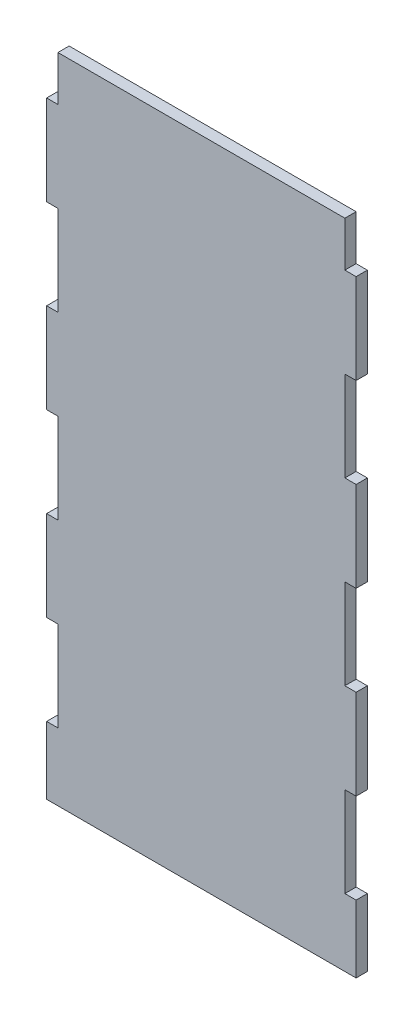
ISO-10303-21;
HEADER;
FILE_DESCRIPTION(('STEP AP214'),'2;1');
FILE_NAME('part.step','',(''),(''),'','','');
FILE_SCHEMA(('AUTOMOTIVE_DESIGN { 1 0 10303 214 1 1 1 1 }'));
ENDSEC;
DATA;
#1=APPLICATION_CONTEXT('core data for automotive mechanical design processes');
#2=APPLICATION_PROTOCOL_DEFINITION('international standard','automotive_design',2000,#1);
#3=PRODUCT_CONTEXT('',#1,'mechanical');
#4=PRODUCT('Part','Part','',(#3));
#5=PRODUCT_RELATED_PRODUCT_CATEGORY('part','',(#4));
#6=PRODUCT_DEFINITION_FORMATION('','',#4);
#7=PRODUCT_DEFINITION_CONTEXT('part definition',#1,'design');
#8=PRODUCT_DEFINITION('design','',#6,#7);
#9=PRODUCT_DEFINITION_SHAPE('','',#8);
#10=(LENGTH_UNIT() NAMED_UNIT(*) SI_UNIT(.MILLI.,.METRE.));
#11=(NAMED_UNIT(*) PLANE_ANGLE_UNIT() SI_UNIT($,.RADIAN.));
#12=(NAMED_UNIT(*) SI_UNIT($,.STERADIAN.) SOLID_ANGLE_UNIT());
#13=UNCERTAINTY_MEASURE_WITH_UNIT(LENGTH_MEASURE(1.E-05),#10,'distance_accuracy_value','');
#14=(GEOMETRIC_REPRESENTATION_CONTEXT(3) GLOBAL_UNCERTAINTY_ASSIGNED_CONTEXT((#13)) GLOBAL_UNIT_ASSIGNED_CONTEXT((#10,
#11,#12)) REPRESENTATION_CONTEXT('',''));
#15=CARTESIAN_POINT('',(0.,0.,0.));
#16=DIRECTION('',(0.,0.,1.));
#17=DIRECTION('',(1.,0.,0.));
#18=AXIS2_PLACEMENT_3D('',#15,#16,#17);
#19=CARTESIAN_POINT('',(0.,0.,3.175));
#20=DIRECTION('',(1.,0.,0.));
#21=DIRECTION('',(0.,1.,0.));
#22=AXIS2_PLACEMENT_3D('',#19,#20,#21);
#23=PLANE('',#22);
#24=DIRECTION('',(0.,-1.,0.));
#25=VECTOR('',#24,1.);
#26=CARTESIAN_POINT('',(0.,0.,0.));
#27=LINE('',#26,#25);
#28=CARTESIAN_POINT('',(0.,12.7,0.));
#29=VERTEX_POINT('',#28);
#30=CARTESIAN_POINT('',(0.,-12.7,0.));
#31=VERTEX_POINT('',#30);
#32=EDGE_CURVE('E157',#29,#31,#27,.T.);
#33=ORIENTED_EDGE('',*,*,#32,.T.);
#34=DIRECTION('',(0.,0.,-1.));
#35=VECTOR('',#34,1.);
#36=CARTESIAN_POINT('',(0.,-12.7,3.175));
#37=LINE('',#36,#35);
#38=CARTESIAN_POINT('',(0.,-12.7,3.175));
#39=VERTEX_POINT('',#38);
#40=EDGE_CURVE('E11',#39,#31,#37,.T.);
#41=ORIENTED_EDGE('',*,*,#40,.F.);
#42=DIRECTION('',(0.,-1.,0.));
#43=VECTOR('',#42,1.);
#44=CARTESIAN_POINT('',(0.,0.,3.175));
#45=LINE('',#44,#43);
#46=CARTESIAN_POINT('',(0.,12.7,3.175));
#47=VERTEX_POINT('',#46);
#48=EDGE_CURVE('E163',#47,#39,#45,.T.);
#49=ORIENTED_EDGE('',*,*,#48,.F.);
#50=DIRECTION('',(0.,0.,-1.));
#51=VECTOR('',#50,1.);
#52=CARTESIAN_POINT('',(0.,12.7,3.175));
#53=LINE('',#52,#51);
#54=EDGE_CURVE('E269',#47,#29,#53,.T.);
#55=ORIENTED_EDGE('',*,*,#54,.T.);
#56=EDGE_LOOP('',(#33,#41,#49,#55));
#57=FACE_BOUND('',#56,.T.);
#58=ADVANCED_FACE('F33',(#57),#23,.F.);
#59=CARTESIAN_POINT('',(0.,-12.7,3.175));
#60=DIRECTION('',(0.,-1.,0.));
#61=DIRECTION('',(0.,0.,-1.));
#62=AXIS2_PLACEMENT_3D('',#59,#60,#61);
#63=PLANE('',#62);
#64=DIRECTION('',(-1.,0.,0.));
#65=VECTOR('',#64,1.);
#66=CARTESIAN_POINT('',(0.,-12.7,0.));
#67=LINE('',#66,#65);
#68=CARTESIAN_POINT('',(-3.17499999999998,-12.7,0.));
#69=VERTEX_POINT('',#68);
#70=EDGE_CURVE('E274',#31,#69,#67,.T.);
#71=ORIENTED_EDGE('',*,*,#70,.T.);
#72=DIRECTION('',(0.,0.,-1.));
#73=VECTOR('',#72,1.);
#74=CARTESIAN_POINT('',(-3.17499999999998,-12.7,3.175));
#75=LINE('',#74,#73);
#76=CARTESIAN_POINT('',(-3.17499999999998,-12.7,3.175));
#77=VERTEX_POINT('',#76);
#78=EDGE_CURVE('E41',#77,#69,#75,.T.);
#79=ORIENTED_EDGE('',*,*,#78,.F.);
#80=DIRECTION('',(-1.,0.,0.));
#81=VECTOR('',#80,1.);
#82=CARTESIAN_POINT('',(0.,-12.7,3.175));
#83=LINE('',#82,#81);
#84=EDGE_CURVE('E503',#39,#77,#83,.T.);
#85=ORIENTED_EDGE('',*,*,#84,.F.);
#86=ORIENTED_EDGE('',*,*,#40,.T.);
#87=EDGE_LOOP('',(#71,#79,#85,#86));
#88=FACE_BOUND('',#87,.T.);
#89=ADVANCED_FACE('F506',(#88),#63,.F.);
#90=CARTESIAN_POINT('',(-3.17499999999998,-12.7,3.175));
#91=DIRECTION('',(1.,0.,0.));
#92=DIRECTION('',(0.,1.,0.));
#93=AXIS2_PLACEMENT_3D('',#90,#91,#92);
#94=PLANE('',#93);
#95=DIRECTION('',(0.,-1.,0.));
#96=VECTOR('',#95,1.);
#97=CARTESIAN_POINT('',(-3.17499999999998,-12.7,0.));
#98=LINE('',#97,#96);
#99=CARTESIAN_POINT('',(-3.175,-31.75,0.));
#100=VERTEX_POINT('',#99);
#101=EDGE_CURVE('E276',#69,#100,#98,.T.);
#102=ORIENTED_EDGE('',*,*,#101,.T.);
#103=DIRECTION('',(0.,0.,-1.));
#104=VECTOR('',#103,1.);
#105=CARTESIAN_POINT('',(-3.175,-31.75,3.175));
#106=LINE('',#105,#104);
#107=CARTESIAN_POINT('',(-3.175,-31.75,3.175));
#108=VERTEX_POINT('',#107);
#109=EDGE_CURVE('E414',#108,#100,#106,.T.);
#110=ORIENTED_EDGE('',*,*,#109,.F.);
#111=DIRECTION('',(0.,-1.,0.));
#112=VECTOR('',#111,1.);
#113=CARTESIAN_POINT('',(-3.17499999999998,-12.7,3.175));
#114=LINE('',#113,#112);
#115=EDGE_CURVE('E423',#77,#108,#114,.T.);
#116=ORIENTED_EDGE('',*,*,#115,.F.);
#117=ORIENTED_EDGE('',*,*,#78,.T.);
#118=EDGE_LOOP('',(#102,#110,#116,#117));
#119=FACE_BOUND('',#118,.T.);
#120=ADVANCED_FACE('F421',(#119),#94,.F.);
#121=CARTESIAN_POINT('',(-3.175,-31.75,3.175));
#122=DIRECTION('',(0.,1.,0.));
#123=DIRECTION('',(-1.,0.,0.));
#124=AXIS2_PLACEMENT_3D('',#121,#122,#123);
#125=PLANE('',#124);
#126=DIRECTION('',(1.,0.,0.));
#127=VECTOR('',#126,1.);
#128=CARTESIAN_POINT('',(-3.175,-31.75,0.));
#129=LINE('',#128,#127);
#130=CARTESIAN_POINT('',(84.175,-31.75,0.));
#131=VERTEX_POINT('',#130);
#132=EDGE_CURVE('E278',#100,#131,#129,.T.);
#133=ORIENTED_EDGE('',*,*,#132,.T.);
#134=DIRECTION('',(0.,0.,-1.));
#135=VECTOR('',#134,1.);
#136=CARTESIAN_POINT('',(84.175,-31.75,3.175));
#137=LINE('',#136,#135);
#138=CARTESIAN_POINT('',(84.175,-31.75,3.175));
#139=VERTEX_POINT('',#138);
#140=EDGE_CURVE('E411',#139,#131,#137,.T.);
#141=ORIENTED_EDGE('',*,*,#140,.F.);
#142=DIRECTION('',(1.,0.,0.));
#143=VECTOR('',#142,1.);
#144=CARTESIAN_POINT('',(-3.175,-31.75,3.175));
#145=LINE('',#144,#143);
#146=EDGE_CURVE('E441',#108,#139,#145,.T.);
#147=ORIENTED_EDGE('',*,*,#146,.F.);
#148=ORIENTED_EDGE('',*,*,#109,.T.);
#149=EDGE_LOOP('',(#133,#141,#147,#148));
#150=FACE_BOUND('',#149,.T.);
#151=ADVANCED_FACE('F432',(#150),#125,.F.);
#152=CARTESIAN_POINT('',(84.175,-12.6999999999999,3.175));
#153=DIRECTION('',(-1.,0.,0.));
#154=DIRECTION('',(0.,-1.,0.));
#155=AXIS2_PLACEMENT_3D('',#152,#153,#154);
#156=PLANE('',#155);
#157=DIRECTION('',(0.,1.,0.));
#158=VECTOR('',#157,1.);
#159=CARTESIAN_POINT('',(84.175,-12.6999999999999,0.));
#160=LINE('',#159,#158);
#161=CARTESIAN_POINT('',(84.175,-12.6999999999999,0.));
#162=VERTEX_POINT('',#161);
#163=EDGE_CURVE('E280',#131,#162,#160,.T.);
#164=ORIENTED_EDGE('',*,*,#163,.T.);
#165=DIRECTION('',(0.,0.,-1.));
#166=VECTOR('',#165,1.);
#167=CARTESIAN_POINT('',(84.175,-12.6999999999999,3.175));
#168=LINE('',#167,#166);
#169=CARTESIAN_POINT('',(84.175,-12.6999999999999,3.175));
#170=VERTEX_POINT('',#169);
#171=EDGE_CURVE('E408',#170,#162,#168,.T.);
#172=ORIENTED_EDGE('',*,*,#171,.F.);
#173=DIRECTION('',(0.,1.,0.));
#174=VECTOR('',#173,1.);
#175=CARTESIAN_POINT('',(84.175,-12.6999999999999,3.175));
#176=LINE('',#175,#174);
#177=EDGE_CURVE('E438',#139,#170,#176,.T.);
#178=ORIENTED_EDGE('',*,*,#177,.F.);
#179=ORIENTED_EDGE('',*,*,#140,.T.);
#180=EDGE_LOOP('',(#164,#172,#178,#179));
#181=FACE_BOUND('',#180,.T.);
#182=ADVANCED_FACE('F436',(#181),#156,.F.);
#183=CARTESIAN_POINT('',(81.,-12.6999999999999,3.175));
#184=DIRECTION('',(0.,-1.,0.));
#185=DIRECTION('',(0.,0.,-1.));
#186=AXIS2_PLACEMENT_3D('',#183,#184,#185);
#187=PLANE('',#186);
#188=DIRECTION('',(-1.,0.,0.));
#189=VECTOR('',#188,1.);
#190=CARTESIAN_POINT('',(81.,-12.6999999999999,0.));
#191=LINE('',#190,#189);
#192=CARTESIAN_POINT('',(81.,-12.6999999999999,0.));
#193=VERTEX_POINT('',#192);
#194=EDGE_CURVE('E282',#162,#193,#191,.T.);
#195=ORIENTED_EDGE('',*,*,#194,.T.);
#196=DIRECTION('',(0.,0.,-1.));
#197=VECTOR('',#196,1.);
#198=CARTESIAN_POINT('',(81.,-12.6999999999999,3.175));
#199=LINE('',#198,#197);
#200=CARTESIAN_POINT('',(81.,-12.6999999999999,3.175));
#201=VERTEX_POINT('',#200);
#202=EDGE_CURVE('E405',#201,#193,#199,.T.);
#203=ORIENTED_EDGE('',*,*,#202,.F.);
#204=DIRECTION('',(-1.,0.,0.));
#205=VECTOR('',#204,1.);
#206=CARTESIAN_POINT('',(81.,-12.6999999999999,3.175));
#207=LINE('',#206,#205);
#208=EDGE_CURVE('E440',#170,#201,#207,.T.);
#209=ORIENTED_EDGE('',*,*,#208,.F.);
#210=ORIENTED_EDGE('',*,*,#171,.T.);
#211=EDGE_LOOP('',(#195,#203,#209,#210));
#212=FACE_BOUND('',#211,.T.);
#213=ADVANCED_FACE('F518',(#212),#187,.F.);
#214=CARTESIAN_POINT('',(81.,1.11022302462516E-13,3.175));
#215=DIRECTION('',(-1.,0.,0.));
#216=DIRECTION('',(0.,0.,1.));
#217=AXIS2_PLACEMENT_3D('',#214,#215,#216);
#218=PLANE('',#217);
#219=DIRECTION('',(0.,1.,0.));
#220=VECTOR('',#219,1.);
#221=CARTESIAN_POINT('',(81.,1.11022302462516E-13,0.));
#222=LINE('',#221,#220);
#223=CARTESIAN_POINT('',(81.,12.7000000000001,0.));
#224=VERTEX_POINT('',#223);
#225=EDGE_CURVE('E285',#193,#224,#222,.T.);
#226=ORIENTED_EDGE('',*,*,#225,.T.);
#227=DIRECTION('',(0.,0.,-1.));
#228=VECTOR('',#227,1.);
#229=CARTESIAN_POINT('',(81.,12.7000000000001,3.175));
#230=LINE('',#229,#228);
#231=CARTESIAN_POINT('',(81.,12.7000000000001,3.175));
#232=VERTEX_POINT('',#231);
#233=EDGE_CURVE('E402',#232,#224,#230,.T.);
#234=ORIENTED_EDGE('',*,*,#233,.F.);
#235=DIRECTION('',(0.,1.,0.));
#236=VECTOR('',#235,1.);
#237=CARTESIAN_POINT('',(81.,1.11022302462516E-13,3.175));
#238=LINE('',#237,#236);
#239=EDGE_CURVE('E443',#201,#232,#238,.T.);
#240=ORIENTED_EDGE('',*,*,#239,.F.);
#241=ORIENTED_EDGE('',*,*,#202,.T.);
#242=EDGE_LOOP('',(#226,#234,#240,#241));
#243=FACE_BOUND('',#242,.T.);
#244=ADVANCED_FACE('F521',(#243),#218,.F.);
#245=CARTESIAN_POINT('',(84.175,12.7000000000001,3.175));
#246=DIRECTION('',(0.,1.,0.));
#247=DIRECTION('',(-1.,0.,0.));
#248=AXIS2_PLACEMENT_3D('',#245,#246,#247);
#249=PLANE('',#248);
#250=DIRECTION('',(1.,0.,0.));
#251=VECTOR('',#250,1.);
#252=CARTESIAN_POINT('',(84.175,12.7000000000001,0.));
#253=LINE('',#252,#251);
#254=CARTESIAN_POINT('',(84.175,12.7000000000001,0.));
#255=VERTEX_POINT('',#254);
#256=EDGE_CURVE('E287',#224,#255,#253,.T.);
#257=ORIENTED_EDGE('',*,*,#256,.T.);
#258=DIRECTION('',(0.,0.,-1.));
#259=VECTOR('',#258,1.);
#260=CARTESIAN_POINT('',(84.175,12.7000000000001,3.175));
#261=LINE('',#260,#259);
#262=CARTESIAN_POINT('',(84.175,12.7000000000001,3.175));
#263=VERTEX_POINT('',#262);
#264=EDGE_CURVE('E399',#263,#255,#261,.T.);
#265=ORIENTED_EDGE('',*,*,#264,.F.);
#266=DIRECTION('',(1.,0.,0.));
#267=VECTOR('',#266,1.);
#268=CARTESIAN_POINT('',(84.175,12.7000000000001,3.175));
#269=LINE('',#268,#267);
#270=EDGE_CURVE('E449',#232,#263,#269,.T.);
#271=ORIENTED_EDGE('',*,*,#270,.F.);
#272=ORIENTED_EDGE('',*,*,#233,.T.);
#273=EDGE_LOOP('',(#257,#265,#271,#272));
#274=FACE_BOUND('',#273,.T.);
#275=ADVANCED_FACE('F525',(#274),#249,.F.);
#276=CARTESIAN_POINT('',(84.175,38.1000000000001,3.175));
#277=DIRECTION('',(-1.,0.,0.));
#278=DIRECTION('',(0.,-1.,0.));
#279=AXIS2_PLACEMENT_3D('',#276,#277,#278);
#280=PLANE('',#279);
#281=DIRECTION('',(0.,1.,0.));
#282=VECTOR('',#281,1.);
#283=CARTESIAN_POINT('',(84.175,38.1000000000001,0.));
#284=LINE('',#283,#282);
#285=CARTESIAN_POINT('',(84.175,38.1000000000001,0.));
#286=VERTEX_POINT('',#285);
#287=EDGE_CURVE('E289',#255,#286,#284,.T.);
#288=ORIENTED_EDGE('',*,*,#287,.T.);
#289=DIRECTION('',(0.,0.,-1.));
#290=VECTOR('',#289,1.);
#291=CARTESIAN_POINT('',(84.175,38.1000000000001,3.175));
#292=LINE('',#291,#290);
#293=CARTESIAN_POINT('',(84.175,38.1000000000001,3.175));
#294=VERTEX_POINT('',#293);
#295=EDGE_CURVE('E396',#294,#286,#292,.T.);
#296=ORIENTED_EDGE('',*,*,#295,.F.);
#297=DIRECTION('',(0.,1.,0.));
#298=VECTOR('',#297,1.);
#299=CARTESIAN_POINT('',(84.175,38.1000000000001,3.175));
#300=LINE('',#299,#298);
#301=EDGE_CURVE('E451',#263,#294,#300,.T.);
#302=ORIENTED_EDGE('',*,*,#301,.F.);
#303=ORIENTED_EDGE('',*,*,#264,.T.);
#304=EDGE_LOOP('',(#288,#296,#302,#303));
#305=FACE_BOUND('',#304,.T.);
#306=ADVANCED_FACE('F529',(#305),#280,.F.);
#307=CARTESIAN_POINT('',(81.,38.1000000000001,3.175));
#308=DIRECTION('',(0.,-1.,0.));
#309=DIRECTION('',(0.,0.,-1.));
#310=AXIS2_PLACEMENT_3D('',#307,#308,#309);
#311=PLANE('',#310);
#312=DIRECTION('',(-1.,0.,0.));
#313=VECTOR('',#312,1.);
#314=CARTESIAN_POINT('',(81.,38.1000000000001,0.));
#315=LINE('',#314,#313);
#316=CARTESIAN_POINT('',(81.,38.1000000000001,0.));
#317=VERTEX_POINT('',#316);
#318=EDGE_CURVE('E291',#286,#317,#315,.T.);
#319=ORIENTED_EDGE('',*,*,#318,.T.);
#320=DIRECTION('',(0.,0.,-1.));
#321=VECTOR('',#320,1.);
#322=CARTESIAN_POINT('',(81.,38.1000000000001,3.175));
#323=LINE('',#322,#321);
#324=CARTESIAN_POINT('',(81.,38.1000000000001,3.175));
#325=VERTEX_POINT('',#324);
#326=EDGE_CURVE('E393',#325,#317,#323,.T.);
#327=ORIENTED_EDGE('',*,*,#326,.F.);
#328=DIRECTION('',(-1.,0.,0.));
#329=VECTOR('',#328,1.);
#330=CARTESIAN_POINT('',(81.,38.1000000000001,3.175));
#331=LINE('',#330,#329);
#332=EDGE_CURVE('E453',#294,#325,#331,.T.);
#333=ORIENTED_EDGE('',*,*,#332,.F.);
#334=ORIENTED_EDGE('',*,*,#295,.T.);
#335=EDGE_LOOP('',(#319,#327,#333,#334));
#336=FACE_BOUND('',#335,.T.);
#337=ADVANCED_FACE('F533',(#336),#311,.F.);
#338=CARTESIAN_POINT('',(81.,38.1000000000001,3.175));
#339=DIRECTION('',(-1.,0.,0.));
#340=DIRECTION('',(0.,-1.,0.));
#341=AXIS2_PLACEMENT_3D('',#338,#339,#340);
#342=PLANE('',#341);
#343=DIRECTION('',(0.,1.,0.));
#344=VECTOR('',#343,1.);
#345=CARTESIAN_POINT('',(81.,38.1000000000001,0.));
#346=LINE('',#345,#344);
#347=CARTESIAN_POINT('',(81.,63.5000000000001,0.));
#348=VERTEX_POINT('',#347);
#349=EDGE_CURVE('E293',#317,#348,#346,.T.);
#350=ORIENTED_EDGE('',*,*,#349,.T.);
#351=DIRECTION('',(0.,0.,-1.));
#352=VECTOR('',#351,1.);
#353=CARTESIAN_POINT('',(81.,63.5000000000001,3.175));
#354=LINE('',#353,#352);
#355=CARTESIAN_POINT('',(81.,63.5000000000001,3.175));
#356=VERTEX_POINT('',#355);
#357=EDGE_CURVE('E390',#356,#348,#354,.T.);
#358=ORIENTED_EDGE('',*,*,#357,.F.);
#359=DIRECTION('',(0.,1.,0.));
#360=VECTOR('',#359,1.);
#361=CARTESIAN_POINT('',(81.,38.1000000000001,3.175));
#362=LINE('',#361,#360);
#363=EDGE_CURVE('E455',#325,#356,#362,.T.);
#364=ORIENTED_EDGE('',*,*,#363,.F.);
#365=ORIENTED_EDGE('',*,*,#326,.T.);
#366=EDGE_LOOP('',(#350,#358,#364,#365));
#367=FACE_BOUND('',#366,.T.);
#368=ADVANCED_FACE('F537',(#367),#342,.F.);
#369=CARTESIAN_POINT('',(84.175,63.5000000000001,3.175));
#370=DIRECTION('',(0.,1.,0.));
#371=DIRECTION('',(0.,0.,1.));
#372=AXIS2_PLACEMENT_3D('',#369,#370,#371);
#373=PLANE('',#372);
#374=DIRECTION('',(1.,0.,0.));
#375=VECTOR('',#374,1.);
#376=CARTESIAN_POINT('',(84.175,63.5000000000001,0.));
#377=LINE('',#376,#375);
#378=CARTESIAN_POINT('',(84.175,63.5000000000001,0.));
#379=VERTEX_POINT('',#378);
#380=EDGE_CURVE('E295',#348,#379,#377,.T.);
#381=ORIENTED_EDGE('',*,*,#380,.T.);
#382=DIRECTION('',(0.,0.,-1.));
#383=VECTOR('',#382,1.);
#384=CARTESIAN_POINT('',(84.175,63.5000000000001,3.175));
#385=LINE('',#384,#383);
#386=CARTESIAN_POINT('',(84.175,63.5000000000001,3.175));
#387=VERTEX_POINT('',#386);
#388=EDGE_CURVE('E387',#387,#379,#385,.T.);
#389=ORIENTED_EDGE('',*,*,#388,.F.);
#390=DIRECTION('',(1.,0.,0.));
#391=VECTOR('',#390,1.);
#392=CARTESIAN_POINT('',(84.175,63.5000000000001,3.175));
#393=LINE('',#392,#391);
#394=EDGE_CURVE('E457',#356,#387,#393,.T.);
#395=ORIENTED_EDGE('',*,*,#394,.F.);
#396=ORIENTED_EDGE('',*,*,#357,.T.);
#397=EDGE_LOOP('',(#381,#389,#395,#396));
#398=FACE_BOUND('',#397,.T.);
#399=ADVANCED_FACE('F541',(#398),#373,.F.);
#400=CARTESIAN_POINT('',(84.175,88.9000000000001,3.175));
#401=DIRECTION('',(-1.,0.,0.));
#402=DIRECTION('',(0.,0.,1.));
#403=AXIS2_PLACEMENT_3D('',#400,#401,#402);
#404=PLANE('',#403);
#405=DIRECTION('',(0.,1.,0.));
#406=VECTOR('',#405,1.);
#407=CARTESIAN_POINT('',(84.175,88.9000000000001,0.));
#408=LINE('',#407,#406);
#409=CARTESIAN_POINT('',(84.175,88.9000000000001,0.));
#410=VERTEX_POINT('',#409);
#411=EDGE_CURVE('E297',#379,#410,#408,.T.);
#412=ORIENTED_EDGE('',*,*,#411,.T.);
#413=DIRECTION('',(0.,0.,-1.));
#414=VECTOR('',#413,1.);
#415=CARTESIAN_POINT('',(84.175,88.9000000000001,3.175));
#416=LINE('',#415,#414);
#417=CARTESIAN_POINT('',(84.175,88.9000000000001,3.175));
#418=VERTEX_POINT('',#417);
#419=EDGE_CURVE('E384',#418,#410,#416,.T.);
#420=ORIENTED_EDGE('',*,*,#419,.F.);
#421=DIRECTION('',(0.,1.,0.));
#422=VECTOR('',#421,1.);
#423=CARTESIAN_POINT('',(84.175,88.9000000000001,3.175));
#424=LINE('',#423,#422);
#425=EDGE_CURVE('E459',#387,#418,#424,.T.);
#426=ORIENTED_EDGE('',*,*,#425,.F.);
#427=ORIENTED_EDGE('',*,*,#388,.T.);
#428=EDGE_LOOP('',(#412,#420,#426,#427));
#429=FACE_BOUND('',#428,.T.);
#430=ADVANCED_FACE('F545',(#429),#404,.F.);
#431=CARTESIAN_POINT('',(81.,88.9000000000001,3.175));
#432=DIRECTION('',(0.,-1.,0.));
#433=DIRECTION('',(0.,0.,-1.));
#434=AXIS2_PLACEMENT_3D('',#431,#432,#433);
#435=PLANE('',#434);
#436=DIRECTION('',(-1.,0.,0.));
#437=VECTOR('',#436,1.);
#438=CARTESIAN_POINT('',(81.,88.9000000000001,0.));
#439=LINE('',#438,#437);
#440=CARTESIAN_POINT('',(81.,88.9000000000001,0.));
#441=VERTEX_POINT('',#440);
#442=EDGE_CURVE('E299',#410,#441,#439,.T.);
#443=ORIENTED_EDGE('',*,*,#442,.T.);
#444=DIRECTION('',(0.,0.,-1.));
#445=VECTOR('',#444,1.);
#446=CARTESIAN_POINT('',(81.,88.9000000000001,3.175));
#447=LINE('',#446,#445);
#448=CARTESIAN_POINT('',(81.,88.9000000000001,3.175));
#449=VERTEX_POINT('',#448);
#450=EDGE_CURVE('E381',#449,#441,#447,.T.);
#451=ORIENTED_EDGE('',*,*,#450,.F.);
#452=DIRECTION('',(-1.,0.,0.));
#453=VECTOR('',#452,1.);
#454=CARTESIAN_POINT('',(81.,88.9000000000001,3.175));
#455=LINE('',#454,#453);
#456=EDGE_CURVE('E461',#418,#449,#455,.T.);
#457=ORIENTED_EDGE('',*,*,#456,.F.);
#458=ORIENTED_EDGE('',*,*,#419,.T.);
#459=EDGE_LOOP('',(#443,#451,#457,#458));
#460=FACE_BOUND('',#459,.T.);
#461=ADVANCED_FACE('F549',(#460),#435,.F.);
#462=CARTESIAN_POINT('',(81.,88.9000000000001,3.175));
#463=DIRECTION('',(-1.,0.,0.));
#464=DIRECTION('',(0.,-1.,0.));
#465=AXIS2_PLACEMENT_3D('',#462,#463,#464);
#466=PLANE('',#465);
#467=DIRECTION('',(0.,1.,0.));
#468=VECTOR('',#467,1.);
#469=CARTESIAN_POINT('',(81.,88.9000000000001,0.));
#470=LINE('',#469,#468);
#471=CARTESIAN_POINT('',(81.,114.3,0.));
#472=VERTEX_POINT('',#471);
#473=EDGE_CURVE('E301',#441,#472,#470,.T.);
#474=ORIENTED_EDGE('',*,*,#473,.T.);
#475=DIRECTION('',(0.,0.,-1.));
#476=VECTOR('',#475,1.);
#477=CARTESIAN_POINT('',(81.,114.3,3.175));
#478=LINE('',#477,#476);
#479=CARTESIAN_POINT('',(81.,114.3,3.175));
#480=VERTEX_POINT('',#479);
#481=EDGE_CURVE('E378',#480,#472,#478,.T.);
#482=ORIENTED_EDGE('',*,*,#481,.F.);
#483=DIRECTION('',(0.,1.,0.));
#484=VECTOR('',#483,1.);
#485=CARTESIAN_POINT('',(81.,88.9000000000001,3.175));
#486=LINE('',#485,#484);
#487=EDGE_CURVE('E463',#449,#480,#486,.T.);
#488=ORIENTED_EDGE('',*,*,#487,.F.);
#489=ORIENTED_EDGE('',*,*,#450,.T.);
#490=EDGE_LOOP('',(#474,#482,#488,#489));
#491=FACE_BOUND('',#490,.T.);
#492=ADVANCED_FACE('F553',(#491),#466,.F.);
#493=CARTESIAN_POINT('',(84.175,114.3,3.175));
#494=DIRECTION('',(0.,1.,0.));
#495=DIRECTION('',(0.,0.,1.));
#496=AXIS2_PLACEMENT_3D('',#493,#494,#495);
#497=PLANE('',#496);
#498=DIRECTION('',(1.,0.,0.));
#499=VECTOR('',#498,1.);
#500=CARTESIAN_POINT('',(84.175,114.3,0.));
#501=LINE('',#500,#499);
#502=CARTESIAN_POINT('',(84.175,114.3,0.));
#503=VERTEX_POINT('',#502);
#504=EDGE_CURVE('E303',#472,#503,#501,.T.);
#505=ORIENTED_EDGE('',*,*,#504,.T.);
#506=DIRECTION('',(0.,0.,-1.));
#507=VECTOR('',#506,1.);
#508=CARTESIAN_POINT('',(84.175,114.3,3.175));
#509=LINE('',#508,#507);
#510=CARTESIAN_POINT('',(84.175,114.3,3.175));
#511=VERTEX_POINT('',#510);
#512=EDGE_CURVE('E375',#511,#503,#509,.T.);
#513=ORIENTED_EDGE('',*,*,#512,.F.);
#514=DIRECTION('',(1.,0.,0.));
#515=VECTOR('',#514,1.);
#516=CARTESIAN_POINT('',(84.175,114.3,3.175));
#517=LINE('',#516,#515);
#518=EDGE_CURVE('E465',#480,#511,#517,.T.);
#519=ORIENTED_EDGE('',*,*,#518,.F.);
#520=ORIENTED_EDGE('',*,*,#481,.T.);
#521=EDGE_LOOP('',(#505,#513,#519,#520));
#522=FACE_BOUND('',#521,.T.);
#523=ADVANCED_FACE('F557',(#522),#497,.F.);
#524=CARTESIAN_POINT('',(84.175,139.7,3.175));
#525=DIRECTION('',(-1.,0.,0.));
#526=DIRECTION('',(0.,-1.,0.));
#527=AXIS2_PLACEMENT_3D('',#524,#525,#526);
#528=PLANE('',#527);
#529=DIRECTION('',(0.,1.,0.));
#530=VECTOR('',#529,1.);
#531=CARTESIAN_POINT('',(84.175,139.7,0.));
#532=LINE('',#531,#530);
#533=CARTESIAN_POINT('',(84.175,139.7,0.));
#534=VERTEX_POINT('',#533);
#535=EDGE_CURVE('E305',#503,#534,#532,.T.);
#536=ORIENTED_EDGE('',*,*,#535,.T.);
#537=DIRECTION('',(0.,0.,-1.));
#538=VECTOR('',#537,1.);
#539=CARTESIAN_POINT('',(84.175,139.7,3.175));
#540=LINE('',#539,#538);
#541=CARTESIAN_POINT('',(84.175,139.7,3.175));
#542=VERTEX_POINT('',#541);
#543=EDGE_CURVE('E372',#542,#534,#540,.T.);
#544=ORIENTED_EDGE('',*,*,#543,.F.);
#545=DIRECTION('',(0.,1.,0.));
#546=VECTOR('',#545,1.);
#547=CARTESIAN_POINT('',(84.175,139.7,3.175));
#548=LINE('',#547,#546);
#549=EDGE_CURVE('E467',#511,#542,#548,.T.);
#550=ORIENTED_EDGE('',*,*,#549,.F.);
#551=ORIENTED_EDGE('',*,*,#512,.T.);
#552=EDGE_LOOP('',(#536,#544,#550,#551));
#553=FACE_BOUND('',#552,.T.);
#554=ADVANCED_FACE('F561',(#553),#528,.F.);
#555=CARTESIAN_POINT('',(81.,139.7,3.175));
#556=DIRECTION('',(0.,-1.,0.));
#557=DIRECTION('',(1.,0.,0.));
#558=AXIS2_PLACEMENT_3D('',#555,#556,#557);
#559=PLANE('',#558);
#560=DIRECTION('',(-1.,0.,0.));
#561=VECTOR('',#560,1.);
#562=CARTESIAN_POINT('',(81.,139.7,0.));
#563=LINE('',#562,#561);
#564=CARTESIAN_POINT('',(81.,139.7,0.));
#565=VERTEX_POINT('',#564);
#566=EDGE_CURVE('E307',#534,#565,#563,.T.);
#567=ORIENTED_EDGE('',*,*,#566,.T.);
#568=DIRECTION('',(0.,0.,-1.));
#569=VECTOR('',#568,1.);
#570=CARTESIAN_POINT('',(81.,139.7,3.175));
#571=LINE('',#570,#569);
#572=CARTESIAN_POINT('',(81.,139.7,3.175));
#573=VERTEX_POINT('',#572);
#574=EDGE_CURVE('E369',#573,#565,#571,.T.);
#575=ORIENTED_EDGE('',*,*,#574,.F.);
#576=DIRECTION('',(-1.,0.,0.));
#577=VECTOR('',#576,1.);
#578=CARTESIAN_POINT('',(81.,139.7,3.175));
#579=LINE('',#578,#577);
#580=EDGE_CURVE('E469',#542,#573,#579,.T.);
#581=ORIENTED_EDGE('',*,*,#580,.F.);
#582=ORIENTED_EDGE('',*,*,#543,.T.);
#583=EDGE_LOOP('',(#567,#575,#581,#582));
#584=FACE_BOUND('',#583,.T.);
#585=ADVANCED_FACE('F565',(#584),#559,.F.);
#586=CARTESIAN_POINT('',(81.,139.7,3.175));
#587=DIRECTION('',(-1.,0.,0.));
#588=DIRECTION('',(0.,0.,1.));
#589=AXIS2_PLACEMENT_3D('',#586,#587,#588);
#590=PLANE('',#589);
#591=DIRECTION('',(0.,1.,0.));
#592=VECTOR('',#591,1.);
#593=CARTESIAN_POINT('',(81.,139.7,0.));
#594=LINE('',#593,#592);
#595=CARTESIAN_POINT('',(81.,152.4,0.));
#596=VERTEX_POINT('',#595);
#597=EDGE_CURVE('E309',#565,#596,#594,.T.);
#598=ORIENTED_EDGE('',*,*,#597,.T.);
#599=DIRECTION('',(0.,0.,-1.));
#600=VECTOR('',#599,1.);
#601=CARTESIAN_POINT('',(81.,152.4,3.175));
#602=LINE('',#601,#600);
#603=CARTESIAN_POINT('',(81.,152.4,3.175));
#604=VERTEX_POINT('',#603);
#605=EDGE_CURVE('E366',#604,#596,#602,.T.);
#606=ORIENTED_EDGE('',*,*,#605,.F.);
#607=DIRECTION('',(0.,1.,0.));
#608=VECTOR('',#607,1.);
#609=CARTESIAN_POINT('',(81.,139.7,3.175));
#610=LINE('',#609,#608);
#611=EDGE_CURVE('E471',#573,#604,#610,.T.);
#612=ORIENTED_EDGE('',*,*,#611,.F.);
#613=ORIENTED_EDGE('',*,*,#574,.T.);
#614=EDGE_LOOP('',(#598,#606,#612,#613));
#615=FACE_BOUND('',#614,.T.);
#616=ADVANCED_FACE('F569',(#615),#590,.F.);
#617=CARTESIAN_POINT('',(0.,152.4,3.175));
#618=DIRECTION('',(0.,-1.,0.));
#619=DIRECTION('',(0.,0.,-1.));
#620=AXIS2_PLACEMENT_3D('',#617,#618,#619);
#621=PLANE('',#620);
#622=DIRECTION('',(-1.,0.,0.));
#623=VECTOR('',#622,1.);
#624=CARTESIAN_POINT('',(0.,152.4,0.));
#625=LINE('',#624,#623);
#626=CARTESIAN_POINT('',(0.,152.4,0.));
#627=VERTEX_POINT('',#626);
#628=EDGE_CURVE('E311',#596,#627,#625,.T.);
#629=ORIENTED_EDGE('',*,*,#628,.T.);
#630=DIRECTION('',(0.,0.,-1.));
#631=VECTOR('',#630,1.);
#632=CARTESIAN_POINT('',(0.,152.4,3.175));
#633=LINE('',#632,#631);
#634=CARTESIAN_POINT('',(0.,152.4,3.175));
#635=VERTEX_POINT('',#634);
#636=EDGE_CURVE('E363',#635,#627,#633,.T.);
#637=ORIENTED_EDGE('',*,*,#636,.F.);
#638=DIRECTION('',(-1.,0.,0.));
#639=VECTOR('',#638,1.);
#640=CARTESIAN_POINT('',(0.,152.4,3.175));
#641=LINE('',#640,#639);
#642=EDGE_CURVE('E473',#604,#635,#641,.T.);
#643=ORIENTED_EDGE('',*,*,#642,.F.);
#644=ORIENTED_EDGE('',*,*,#605,.T.);
#645=EDGE_LOOP('',(#629,#637,#643,#644));
#646=FACE_BOUND('',#645,.T.);
#647=ADVANCED_FACE('F573',(#646),#621,.F.);
#648=CARTESIAN_POINT('',(0.,139.7,3.175));
#649=DIRECTION('',(1.,0.,0.));
#650=DIRECTION('',(0.,0.,-1.));
#651=AXIS2_PLACEMENT_3D('',#648,#649,#650);
#652=PLANE('',#651);
#653=DIRECTION('',(0.,-1.,0.));
#654=VECTOR('',#653,1.);
#655=CARTESIAN_POINT('',(0.,139.7,0.));
#656=LINE('',#655,#654);
#657=CARTESIAN_POINT('',(0.,139.7,0.));
#658=VERTEX_POINT('',#657);
#659=EDGE_CURVE('E313',#627,#658,#656,.T.);
#660=ORIENTED_EDGE('',*,*,#659,.T.);
#661=DIRECTION('',(0.,0.,-1.));
#662=VECTOR('',#661,1.);
#663=CARTESIAN_POINT('',(0.,139.7,3.175));
#664=LINE('',#663,#662);
#665=CARTESIAN_POINT('',(0.,139.7,3.175));
#666=VERTEX_POINT('',#665);
#667=EDGE_CURVE('E360',#666,#658,#664,.T.);
#668=ORIENTED_EDGE('',*,*,#667,.F.);
#669=DIRECTION('',(0.,-1.,0.));
#670=VECTOR('',#669,1.);
#671=CARTESIAN_POINT('',(0.,139.7,3.175));
#672=LINE('',#671,#670);
#673=EDGE_CURVE('E475',#635,#666,#672,.T.);
#674=ORIENTED_EDGE('',*,*,#673,.F.);
#675=ORIENTED_EDGE('',*,*,#636,.T.);
#676=EDGE_LOOP('',(#660,#668,#674,#675));
#677=FACE_BOUND('',#676,.T.);
#678=ADVANCED_FACE('F577',(#677),#652,.F.);
#679=CARTESIAN_POINT('',(0.,139.7,3.175));
#680=DIRECTION('',(0.,-1.,0.));
#681=DIRECTION('',(0.,0.,-1.));
#682=AXIS2_PLACEMENT_3D('',#679,#680,#681);
#683=PLANE('',#682);
#684=DIRECTION('',(-1.,0.,0.));
#685=VECTOR('',#684,1.);
#686=CARTESIAN_POINT('',(0.,139.7,0.));
#687=LINE('',#686,#685);
#688=CARTESIAN_POINT('',(-3.175,139.7,0.));
#689=VERTEX_POINT('',#688);
#690=EDGE_CURVE('E315',#658,#689,#687,.T.);
#691=ORIENTED_EDGE('',*,*,#690,.T.);
#692=DIRECTION('',(0.,0.,-1.));
#693=VECTOR('',#692,1.);
#694=CARTESIAN_POINT('',(-3.175,139.7,3.175));
#695=LINE('',#694,#693);
#696=CARTESIAN_POINT('',(-3.175,139.7,3.175));
#697=VERTEX_POINT('',#696);
#698=EDGE_CURVE('E357',#697,#689,#695,.T.);
#699=ORIENTED_EDGE('',*,*,#698,.F.);
#700=DIRECTION('',(-1.,0.,0.));
#701=VECTOR('',#700,1.);
#702=CARTESIAN_POINT('',(0.,139.7,3.175));
#703=LINE('',#702,#701);
#704=EDGE_CURVE('E477',#666,#697,#703,.T.);
#705=ORIENTED_EDGE('',*,*,#704,.F.);
#706=ORIENTED_EDGE('',*,*,#667,.T.);
#707=EDGE_LOOP('',(#691,#699,#705,#706));
#708=FACE_BOUND('',#707,.T.);
#709=ADVANCED_FACE('F581',(#708),#683,.F.);
#710=CARTESIAN_POINT('',(-3.175,139.7,3.175));
#711=DIRECTION('',(1.,0.,0.));
#712=DIRECTION('',(0.,1.,0.));
#713=AXIS2_PLACEMENT_3D('',#710,#711,#712);
#714=PLANE('',#713);
#715=DIRECTION('',(0.,-1.,0.));
#716=VECTOR('',#715,1.);
#717=CARTESIAN_POINT('',(-3.175,139.7,0.));
#718=LINE('',#717,#716);
#719=CARTESIAN_POINT('',(-3.175,114.3,0.));
#720=VERTEX_POINT('',#719);
#721=EDGE_CURVE('E317',#689,#720,#718,.T.);
#722=ORIENTED_EDGE('',*,*,#721,.T.);
#723=DIRECTION('',(0.,0.,-1.));
#724=VECTOR('',#723,1.);
#725=CARTESIAN_POINT('',(-3.175,114.3,3.175));
#726=LINE('',#725,#724);
#727=CARTESIAN_POINT('',(-3.175,114.3,3.175));
#728=VERTEX_POINT('',#727);
#729=EDGE_CURVE('E354',#728,#720,#726,.T.);
#730=ORIENTED_EDGE('',*,*,#729,.F.);
#731=DIRECTION('',(0.,-1.,0.));
#732=VECTOR('',#731,1.);
#733=CARTESIAN_POINT('',(-3.175,139.7,3.175));
#734=LINE('',#733,#732);
#735=EDGE_CURVE('E479',#697,#728,#734,.T.);
#736=ORIENTED_EDGE('',*,*,#735,.F.);
#737=ORIENTED_EDGE('',*,*,#698,.T.);
#738=EDGE_LOOP('',(#722,#730,#736,#737));
#739=FACE_BOUND('',#738,.T.);
#740=ADVANCED_FACE('F585',(#739),#714,.F.);
#741=CARTESIAN_POINT('',(-3.175,114.3,3.175));
#742=DIRECTION('',(0.,1.,0.));
#743=DIRECTION('',(0.,0.,1.));
#744=AXIS2_PLACEMENT_3D('',#741,#742,#743);
#745=PLANE('',#744);
#746=DIRECTION('',(1.,0.,0.));
#747=VECTOR('',#746,1.);
#748=CARTESIAN_POINT('',(-3.175,114.3,0.));
#749=LINE('',#748,#747);
#750=CARTESIAN_POINT('',(0.,114.3,0.));
#751=VERTEX_POINT('',#750);
#752=EDGE_CURVE('E319',#720,#751,#749,.T.);
#753=ORIENTED_EDGE('',*,*,#752,.T.);
#754=DIRECTION('',(0.,0.,-1.));
#755=VECTOR('',#754,1.);
#756=CARTESIAN_POINT('',(0.,114.3,3.175));
#757=LINE('',#756,#755);
#758=CARTESIAN_POINT('',(0.,114.3,3.175));
#759=VERTEX_POINT('',#758);
#760=EDGE_CURVE('E351',#759,#751,#757,.T.);
#761=ORIENTED_EDGE('',*,*,#760,.F.);
#762=DIRECTION('',(1.,0.,0.));
#763=VECTOR('',#762,1.);
#764=CARTESIAN_POINT('',(-3.175,114.3,3.175));
#765=LINE('',#764,#763);
#766=EDGE_CURVE('E481',#728,#759,#765,.T.);
#767=ORIENTED_EDGE('',*,*,#766,.F.);
#768=ORIENTED_EDGE('',*,*,#729,.T.);
#769=EDGE_LOOP('',(#753,#761,#767,#768));
#770=FACE_BOUND('',#769,.T.);
#771=ADVANCED_FACE('F589',(#770),#745,.F.);
#772=CARTESIAN_POINT('',(0.,88.9,3.175));
#773=DIRECTION('',(1.,0.,0.));
#774=DIRECTION('',(0.,1.,0.));
#775=AXIS2_PLACEMENT_3D('',#772,#773,#774);
#776=PLANE('',#775);
#777=DIRECTION('',(0.,-1.,0.));
#778=VECTOR('',#777,1.);
#779=CARTESIAN_POINT('',(0.,88.9,0.));
#780=LINE('',#779,#778);
#781=CARTESIAN_POINT('',(0.,88.9,0.));
#782=VERTEX_POINT('',#781);
#783=EDGE_CURVE('E321',#751,#782,#780,.T.);
#784=ORIENTED_EDGE('',*,*,#783,.T.);
#785=DIRECTION('',(0.,0.,-1.));
#786=VECTOR('',#785,1.);
#787=CARTESIAN_POINT('',(0.,88.9,3.175));
#788=LINE('',#787,#786);
#789=CARTESIAN_POINT('',(0.,88.9,3.175));
#790=VERTEX_POINT('',#789);
#791=EDGE_CURVE('E348',#790,#782,#788,.T.);
#792=ORIENTED_EDGE('',*,*,#791,.F.);
#793=DIRECTION('',(0.,-1.,0.));
#794=VECTOR('',#793,1.);
#795=CARTESIAN_POINT('',(0.,88.9,3.175));
#796=LINE('',#795,#794);
#797=EDGE_CURVE('E483',#759,#790,#796,.T.);
#798=ORIENTED_EDGE('',*,*,#797,.F.);
#799=ORIENTED_EDGE('',*,*,#760,.T.);
#800=EDGE_LOOP('',(#784,#792,#798,#799));
#801=FACE_BOUND('',#800,.T.);
#802=ADVANCED_FACE('F593',(#801),#776,.F.);
#803=CARTESIAN_POINT('',(0.,88.9,3.175));
#804=DIRECTION('',(0.,-1.,0.));
#805=DIRECTION('',(0.,0.,-1.));
#806=AXIS2_PLACEMENT_3D('',#803,#804,#805);
#807=PLANE('',#806);
#808=DIRECTION('',(-1.,0.,0.));
#809=VECTOR('',#808,1.);
#810=CARTESIAN_POINT('',(0.,88.9,0.));
#811=LINE('',#810,#809);
#812=CARTESIAN_POINT('',(-3.17499999999999,88.9,0.));
#813=VERTEX_POINT('',#812);
#814=EDGE_CURVE('E323',#782,#813,#811,.T.);
#815=ORIENTED_EDGE('',*,*,#814,.T.);
#816=DIRECTION('',(0.,0.,-1.));
#817=VECTOR('',#816,1.);
#818=CARTESIAN_POINT('',(-3.17499999999999,88.9,3.175));
#819=LINE('',#818,#817);
#820=CARTESIAN_POINT('',(-3.17499999999999,88.9,3.175));
#821=VERTEX_POINT('',#820);
#822=EDGE_CURVE('E345',#821,#813,#819,.T.);
#823=ORIENTED_EDGE('',*,*,#822,.F.);
#824=DIRECTION('',(-1.,0.,0.));
#825=VECTOR('',#824,1.);
#826=CARTESIAN_POINT('',(0.,88.9,3.175));
#827=LINE('',#826,#825);
#828=EDGE_CURVE('E485',#790,#821,#827,.T.);
#829=ORIENTED_EDGE('',*,*,#828,.F.);
#830=ORIENTED_EDGE('',*,*,#791,.T.);
#831=EDGE_LOOP('',(#815,#823,#829,#830));
#832=FACE_BOUND('',#831,.T.);
#833=ADVANCED_FACE('F597',(#832),#807,.F.);
#834=CARTESIAN_POINT('',(-3.17499999999999,88.9,3.175));
#835=DIRECTION('',(1.,0.,0.));
#836=DIRECTION('',(0.,1.,0.));
#837=AXIS2_PLACEMENT_3D('',#834,#835,#836);
#838=PLANE('',#837);
#839=DIRECTION('',(0.,-1.,0.));
#840=VECTOR('',#839,1.);
#841=CARTESIAN_POINT('',(-3.17499999999999,88.9,0.));
#842=LINE('',#841,#840);
#843=CARTESIAN_POINT('',(-3.17499999999999,63.5,0.));
#844=VERTEX_POINT('',#843);
#845=EDGE_CURVE('E325',#813,#844,#842,.T.);
#846=ORIENTED_EDGE('',*,*,#845,.T.);
#847=DIRECTION('',(0.,0.,-1.));
#848=VECTOR('',#847,1.);
#849=CARTESIAN_POINT('',(-3.17499999999999,63.5,3.175));
#850=LINE('',#849,#848);
#851=CARTESIAN_POINT('',(-3.17499999999999,63.5,3.175));
#852=VERTEX_POINT('',#851);
#853=EDGE_CURVE('E342',#852,#844,#850,.T.);
#854=ORIENTED_EDGE('',*,*,#853,.F.);
#855=DIRECTION('',(0.,-1.,0.));
#856=VECTOR('',#855,1.);
#857=CARTESIAN_POINT('',(-3.17499999999999,88.9,3.175));
#858=LINE('',#857,#856);
#859=EDGE_CURVE('E487',#821,#852,#858,.T.);
#860=ORIENTED_EDGE('',*,*,#859,.F.);
#861=ORIENTED_EDGE('',*,*,#822,.T.);
#862=EDGE_LOOP('',(#846,#854,#860,#861));
#863=FACE_BOUND('',#862,.T.);
#864=ADVANCED_FACE('F601',(#863),#838,.F.);
#865=CARTESIAN_POINT('',(-3.17499999999999,63.5,3.175));
#866=DIRECTION('',(0.,1.,0.));
#867=DIRECTION('',(0.,0.,1.));
#868=AXIS2_PLACEMENT_3D('',#865,#866,#867);
#869=PLANE('',#868);
#870=DIRECTION('',(1.,0.,0.));
#871=VECTOR('',#870,1.);
#872=CARTESIAN_POINT('',(-3.17499999999999,63.5,0.));
#873=LINE('',#872,#871);
#874=CARTESIAN_POINT('',(0.,63.5,0.));
#875=VERTEX_POINT('',#874);
#876=EDGE_CURVE('E327',#844,#875,#873,.T.);
#877=ORIENTED_EDGE('',*,*,#876,.T.);
#878=DIRECTION('',(0.,0.,-1.));
#879=VECTOR('',#878,1.);
#880=CARTESIAN_POINT('',(0.,63.5,3.175));
#881=LINE('',#880,#879);
#882=CARTESIAN_POINT('',(0.,63.5,3.175));
#883=VERTEX_POINT('',#882);
#884=EDGE_CURVE('E339',#883,#875,#881,.T.);
#885=ORIENTED_EDGE('',*,*,#884,.F.);
#886=DIRECTION('',(1.,0.,0.));
#887=VECTOR('',#886,1.);
#888=CARTESIAN_POINT('',(-3.17499999999999,63.5,3.175));
#889=LINE('',#888,#887);
#890=EDGE_CURVE('E489',#852,#883,#889,.T.);
#891=ORIENTED_EDGE('',*,*,#890,.F.);
#892=ORIENTED_EDGE('',*,*,#853,.T.);
#893=EDGE_LOOP('',(#877,#885,#891,#892));
#894=FACE_BOUND('',#893,.T.);
#895=ADVANCED_FACE('F495',(#894),#869,.F.);
#896=CARTESIAN_POINT('',(0.,38.1,3.175));
#897=DIRECTION('',(1.,0.,0.));
#898=DIRECTION('',(0.,1.,0.));
#899=AXIS2_PLACEMENT_3D('',#896,#897,#898);
#900=PLANE('',#899);
#901=DIRECTION('',(0.,-1.,0.));
#902=VECTOR('',#901,1.);
#903=CARTESIAN_POINT('',(0.,38.1,0.));
#904=LINE('',#903,#902);
#905=CARTESIAN_POINT('',(0.,38.1,0.));
#906=VERTEX_POINT('',#905);
#907=EDGE_CURVE('E329',#875,#906,#904,.T.);
#908=ORIENTED_EDGE('',*,*,#907,.T.);
#909=DIRECTION('',(0.,0.,-1.));
#910=VECTOR('',#909,1.);
#911=CARTESIAN_POINT('',(0.,38.1,3.175));
#912=LINE('',#911,#910);
#913=CARTESIAN_POINT('',(0.,38.1,3.175));
#914=VERTEX_POINT('',#913);
#915=EDGE_CURVE('E264',#914,#906,#912,.T.);
#916=ORIENTED_EDGE('',*,*,#915,.F.);
#917=DIRECTION('',(0.,-1.,0.));
#918=VECTOR('',#917,1.);
#919=CARTESIAN_POINT('',(0.,38.1,3.175));
#920=LINE('',#919,#918);
#921=EDGE_CURVE('E255',#883,#914,#920,.T.);
#922=ORIENTED_EDGE('',*,*,#921,.F.);
#923=ORIENTED_EDGE('',*,*,#884,.T.);
#924=EDGE_LOOP('',(#908,#916,#922,#923));
#925=FACE_BOUND('',#924,.T.);
#926=ADVANCED_FACE('F499',(#925),#900,.F.);
#927=CARTESIAN_POINT('',(0.,38.1,3.175));
#928=DIRECTION('',(0.,-1.,0.));
#929=DIRECTION('',(0.,0.,-1.));
#930=AXIS2_PLACEMENT_3D('',#927,#928,#929);
#931=PLANE('',#930);
#932=DIRECTION('',(-1.,0.,0.));
#933=VECTOR('',#932,1.);
#934=CARTESIAN_POINT('',(0.,38.1,0.));
#935=LINE('',#934,#933);
#936=CARTESIAN_POINT('',(-3.17499999999999,38.1,0.));
#937=VERTEX_POINT('',#936);
#938=EDGE_CURVE('E263',#906,#937,#935,.T.);
#939=ORIENTED_EDGE('',*,*,#938,.T.);
#940=DIRECTION('',(0.,0.,-1.));
#941=VECTOR('',#940,1.);
#942=CARTESIAN_POINT('',(-3.17499999999999,38.1,3.175));
#943=LINE('',#942,#941);
#944=CARTESIAN_POINT('',(-3.17499999999999,38.1,3.175));
#945=VERTEX_POINT('',#944);
#946=EDGE_CURVE('E260',#945,#937,#943,.T.);
#947=ORIENTED_EDGE('',*,*,#946,.F.);
#948=DIRECTION('',(-1.,0.,0.));
#949=VECTOR('',#948,1.);
#950=CARTESIAN_POINT('',(0.,38.1,3.175));
#951=LINE('',#950,#949);
#952=EDGE_CURVE('E249',#914,#945,#951,.T.);
#953=ORIENTED_EDGE('',*,*,#952,.F.);
#954=ORIENTED_EDGE('',*,*,#915,.T.);
#955=EDGE_LOOP('',(#939,#947,#953,#954));
#956=FACE_BOUND('',#955,.T.);
#957=ADVANCED_FACE('F261',(#956),#931,.F.);
#958=CARTESIAN_POINT('',(-3.17499999999999,38.1,3.175));
#959=DIRECTION('',(1.,0.,0.));
#960=DIRECTION('',(0.,1.,0.));
#961=AXIS2_PLACEMENT_3D('',#958,#959,#960);
#962=PLANE('',#961);
#963=DIRECTION('',(0.,-1.,0.));
#964=VECTOR('',#963,1.);
#965=CARTESIAN_POINT('',(-3.17499999999999,38.1,0.));
#966=LINE('',#965,#964);
#967=CARTESIAN_POINT('',(-3.17499999999998,12.7,0.));
#968=VERTEX_POINT('',#967);
#969=EDGE_CURVE('E150',#937,#968,#966,.T.);
#970=ORIENTED_EDGE('',*,*,#969,.T.);
#971=DIRECTION('',(0.,0.,-1.));
#972=VECTOR('',#971,1.);
#973=CARTESIAN_POINT('',(-3.17499999999998,12.7,3.175));
#974=LINE('',#973,#972);
#975=CARTESIAN_POINT('',(-3.17499999999998,12.7,3.175));
#976=VERTEX_POINT('',#975);
#977=EDGE_CURVE('E265',#976,#968,#974,.T.);
#978=ORIENTED_EDGE('',*,*,#977,.F.);
#979=DIRECTION('',(0.,-1.,0.));
#980=VECTOR('',#979,1.);
#981=CARTESIAN_POINT('',(-3.17499999999999,38.1,3.175));
#982=LINE('',#981,#980);
#983=EDGE_CURVE('E253',#945,#976,#982,.T.);
#984=ORIENTED_EDGE('',*,*,#983,.F.);
#985=ORIENTED_EDGE('',*,*,#946,.T.);
#986=EDGE_LOOP('',(#970,#978,#984,#985));
#987=FACE_BOUND('',#986,.T.);
#988=ADVANCED_FACE('F267',(#987),#962,.F.);
#989=CARTESIAN_POINT('',(-3.17499999999998,12.7,3.175));
#990=DIRECTION('',(0.,1.,0.));
#991=DIRECTION('',(-1.,0.,0.));
#992=AXIS2_PLACEMENT_3D('',#989,#990,#991);
#993=PLANE('',#992);
#994=DIRECTION('',(1.,0.,0.));
#995=VECTOR('',#994,1.);
#996=CARTESIAN_POINT('',(-3.17499999999998,12.7,0.));
#997=LINE('',#996,#995);
#998=EDGE_CURVE('E333',#968,#29,#997,.T.);
#999=ORIENTED_EDGE('',*,*,#998,.T.);
#1000=ORIENTED_EDGE('',*,*,#54,.F.);
#1001=DIRECTION('',(1.,0.,0.));
#1002=VECTOR('',#1001,1.);
#1003=CARTESIAN_POINT('',(-3.17499999999998,12.7,3.175));
#1004=LINE('',#1003,#1002);
#1005=EDGE_CURVE('E49',#976,#47,#1004,.T.);
#1006=ORIENTED_EDGE('',*,*,#1005,.F.);
#1007=ORIENTED_EDGE('',*,*,#977,.T.);
#1008=EDGE_LOOP('',(#999,#1000,#1006,#1007));
#1009=FACE_BOUND('',#1008,.T.);
#1010=ADVANCED_FACE('F501',(#1009),#993,.F.);
#1011=CARTESIAN_POINT('',(0.,12.7,3.175));
#1012=DIRECTION('',(0.,0.,-1.));
#1013=DIRECTION('',(-1.,0.,0.));
#1014=AXIS2_PLACEMENT_3D('',#1011,#1012,#1013);
#1015=PLANE('',#1014);
#1016=ORIENTED_EDGE('',*,*,#48,.T.);
#1017=ORIENTED_EDGE('',*,*,#84,.T.);
#1018=ORIENTED_EDGE('',*,*,#115,.T.);
#1019=ORIENTED_EDGE('',*,*,#146,.T.);
#1020=ORIENTED_EDGE('',*,*,#177,.T.);
#1021=ORIENTED_EDGE('',*,*,#208,.T.);
#1022=ORIENTED_EDGE('',*,*,#239,.T.);
#1023=ORIENTED_EDGE('',*,*,#270,.T.);
#1024=ORIENTED_EDGE('',*,*,#301,.T.);
#1025=ORIENTED_EDGE('',*,*,#332,.T.);
#1026=ORIENTED_EDGE('',*,*,#363,.T.);
#1027=ORIENTED_EDGE('',*,*,#394,.T.);
#1028=ORIENTED_EDGE('',*,*,#425,.T.);
#1029=ORIENTED_EDGE('',*,*,#456,.T.);
#1030=ORIENTED_EDGE('',*,*,#487,.T.);
#1031=ORIENTED_EDGE('',*,*,#518,.T.);
#1032=ORIENTED_EDGE('',*,*,#549,.T.);
#1033=ORIENTED_EDGE('',*,*,#580,.T.);
#1034=ORIENTED_EDGE('',*,*,#611,.T.);
#1035=ORIENTED_EDGE('',*,*,#642,.T.);
#1036=ORIENTED_EDGE('',*,*,#673,.T.);
#1037=ORIENTED_EDGE('',*,*,#704,.T.);
#1038=ORIENTED_EDGE('',*,*,#735,.T.);
#1039=ORIENTED_EDGE('',*,*,#766,.T.);
#1040=ORIENTED_EDGE('',*,*,#797,.T.);
#1041=ORIENTED_EDGE('',*,*,#828,.T.);
#1042=ORIENTED_EDGE('',*,*,#859,.T.);
#1043=ORIENTED_EDGE('',*,*,#890,.T.);
#1044=ORIENTED_EDGE('',*,*,#921,.T.);
#1045=ORIENTED_EDGE('',*,*,#952,.T.);
#1046=ORIENTED_EDGE('',*,*,#983,.T.);
#1047=ORIENTED_EDGE('',*,*,#1005,.T.);
#1048=EDGE_LOOP('',(#1016,#1017,#1018,#1019,#1020,#1021,#1022,#1023,#1024,#1025,#1026,#1027,
#1028,#1029,#1030,#1031,#1032,#1033,#1034,#1035,#1036,#1037,#1038,#1039,#1040,#1041,#1042,#1043,
#1044,#1045,#1046,#1047));
#1049=FACE_BOUND('',#1048,.T.);
#1050=ADVANCED_FACE('F251',(#1049),#1015,.F.);
#1051=CARTESIAN_POINT('',(0.,12.7,0.));
#1052=DIRECTION('',(0.,0.,-1.));
#1053=DIRECTION('',(-1.,0.,0.));
#1054=AXIS2_PLACEMENT_3D('',#1051,#1052,#1053);
#1055=PLANE('',#1054);
#1056=ORIENTED_EDGE('',*,*,#32,.F.);
#1057=ORIENTED_EDGE('',*,*,#998,.F.);
#1058=ORIENTED_EDGE('',*,*,#969,.F.);
#1059=ORIENTED_EDGE('',*,*,#938,.F.);
#1060=ORIENTED_EDGE('',*,*,#907,.F.);
#1061=ORIENTED_EDGE('',*,*,#876,.F.);
#1062=ORIENTED_EDGE('',*,*,#845,.F.);
#1063=ORIENTED_EDGE('',*,*,#814,.F.);
#1064=ORIENTED_EDGE('',*,*,#783,.F.);
#1065=ORIENTED_EDGE('',*,*,#752,.F.);
#1066=ORIENTED_EDGE('',*,*,#721,.F.);
#1067=ORIENTED_EDGE('',*,*,#690,.F.);
#1068=ORIENTED_EDGE('',*,*,#659,.F.);
#1069=ORIENTED_EDGE('',*,*,#628,.F.);
#1070=ORIENTED_EDGE('',*,*,#597,.F.);
#1071=ORIENTED_EDGE('',*,*,#566,.F.);
#1072=ORIENTED_EDGE('',*,*,#535,.F.);
#1073=ORIENTED_EDGE('',*,*,#504,.F.);
#1074=ORIENTED_EDGE('',*,*,#473,.F.);
#1075=ORIENTED_EDGE('',*,*,#442,.F.);
#1076=ORIENTED_EDGE('',*,*,#411,.F.);
#1077=ORIENTED_EDGE('',*,*,#380,.F.);
#1078=ORIENTED_EDGE('',*,*,#349,.F.);
#1079=ORIENTED_EDGE('',*,*,#318,.F.);
#1080=ORIENTED_EDGE('',*,*,#287,.F.);
#1081=ORIENTED_EDGE('',*,*,#256,.F.);
#1082=ORIENTED_EDGE('',*,*,#225,.F.);
#1083=ORIENTED_EDGE('',*,*,#194,.F.);
#1084=ORIENTED_EDGE('',*,*,#163,.F.);
#1085=ORIENTED_EDGE('',*,*,#132,.F.);
#1086=ORIENTED_EDGE('',*,*,#101,.F.);
#1087=ORIENTED_EDGE('',*,*,#70,.F.);
#1088=EDGE_LOOP('',(#1056,#1057,#1058,#1059,#1060,#1061,#1062,#1063,#1064,#1065,#1066,#1067,
#1068,#1069,#1070,#1071,#1072,#1073,#1074,#1075,#1076,#1077,#1078,#1079,#1080,#1081,#1082,#1083,
#1084,#1085,#1086,#1087));
#1089=FACE_BOUND('',#1088,.T.);
#1090=ADVANCED_FACE('F427',(#1089),#1055,.T.);
#1091=CLOSED_SHELL('',(#58,#89,#120,#151,#182,#213,#244,#275,#306,#337,#368,#399,#430,#461,#492,
#523,#554,#585,#616,#647,#678,#709,#740,#771,#802,#833,#864,#895,#926,#957,#988,#1010,#1050,#1090));
#1092=MANIFOLD_SOLID_BREP('B2',#1091);
#1093=ADVANCED_BREP_SHAPE_REPRESENTATION('',(#18,#1092),#14);
#1094=SHAPE_DEFINITION_REPRESENTATION(#9,#1093);
ENDSEC;
END-ISO-10303-21;
